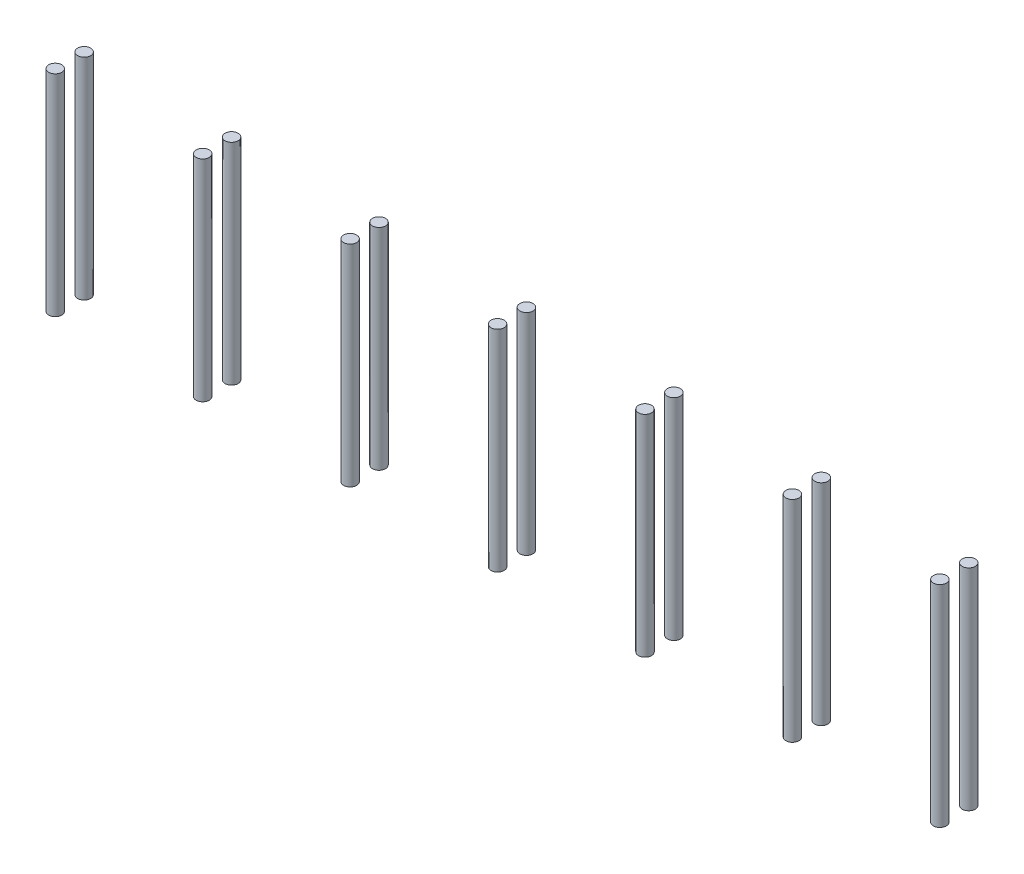
ISO-10303-21;
HEADER;
FILE_DESCRIPTION(('STEP AP214'),'2;1');
FILE_NAME('part.step','',(''),(''),'','','');
FILE_SCHEMA(('AUTOMOTIVE_DESIGN { 1 0 10303 214 1 1 1 1 }'));
ENDSEC;
DATA;
#1=APPLICATION_CONTEXT('core data for automotive mechanical design processes');
#2=APPLICATION_PROTOCOL_DEFINITION('international standard','automotive_design',2000,#1);
#3=PRODUCT_CONTEXT('',#1,'mechanical');
#4=PRODUCT('Part','Part','',(#3));
#5=PRODUCT_RELATED_PRODUCT_CATEGORY('part','',(#4));
#6=PRODUCT_DEFINITION_FORMATION('','',#4);
#7=PRODUCT_DEFINITION_CONTEXT('part definition',#1,'design');
#8=PRODUCT_DEFINITION('design','',#6,#7);
#9=PRODUCT_DEFINITION_SHAPE('','',#8);
#10=(LENGTH_UNIT() NAMED_UNIT(*) SI_UNIT(.MILLI.,.METRE.));
#11=(NAMED_UNIT(*) PLANE_ANGLE_UNIT() SI_UNIT($,.RADIAN.));
#12=(NAMED_UNIT(*) SI_UNIT($,.STERADIAN.) SOLID_ANGLE_UNIT());
#13=UNCERTAINTY_MEASURE_WITH_UNIT(LENGTH_MEASURE(1.E-05),#10,'distance_accuracy_value','');
#14=(GEOMETRIC_REPRESENTATION_CONTEXT(3) GLOBAL_UNCERTAINTY_ASSIGNED_CONTEXT((#13)) GLOBAL_UNIT_ASSIGNED_CONTEXT((#10,
#11,#12)) REPRESENTATION_CONTEXT('',''));
#15=CARTESIAN_POINT('',(0.,0.,0.));
#16=DIRECTION('',(0.,0.,1.));
#17=DIRECTION('',(1.,0.,0.));
#18=AXIS2_PLACEMENT_3D('',#15,#16,#17);
#19=CARTESIAN_POINT('',(362.5,109.980256121071,-27.9999999999911));
#20=DIRECTION('',(0.,-1.,0.));
#21=DIRECTION('',(1.,0.,0.));
#22=AXIS2_PLACEMENT_3D('',#19,#20,#21);
#23=CYLINDRICAL_SURFACE('',#22,3.17499999999997);
#24=CARTESIAN_POINT('',(362.5,-0.999999999998734,-27.9999999999911));
#25=DIRECTION('',(0.,1.,0.));
#26=DIRECTION('',(-1.,0.,0.));
#27=AXIS2_PLACEMENT_3D('',#24,#25,#26);
#28=CIRCLE('',#27,3.17499999999997);
#29=CARTESIAN_POINT('',(359.325,-0.999999999998745,-27.9999999999911));
#30=VERTEX_POINT('',#29);
#31=EDGE_CURVE('E47',#30,#30,#28,.T.);
#32=ORIENTED_EDGE('',*,*,#31,.T.);
#33=EDGE_LOOP('',(#32));
#34=FACE_BOUND('',#33,.T.);
#35=CARTESIAN_POINT('',(362.5,101.000000000001,-27.9999999999911));
#36=DIRECTION('',(0.,1.,0.));
#37=DIRECTION('',(-1.,0.,0.));
#38=AXIS2_PLACEMENT_3D('',#35,#36,#37);
#39=CIRCLE('',#38,3.17499999999997);
#40=CARTESIAN_POINT('',(359.325,101.000000000001,-27.9999999999911));
#41=VERTEX_POINT('',#40);
#42=EDGE_CURVE('E11',#41,#41,#39,.T.);
#43=ORIENTED_EDGE('',*,*,#42,.F.);
#44=EDGE_LOOP('',(#43));
#45=FACE_BOUND('',#44,.T.);
#46=ADVANCED_FACE('F40',(#34,#45),#23,.T.);
#47=CARTESIAN_POINT('',(362.5,-0.999999999998734,-27.9999999999911));
#48=DIRECTION('',(0.,1.,0.));
#49=DIRECTION('',(-1.,0.,0.));
#50=AXIS2_PLACEMENT_3D('',#47,#48,#49);
#51=PLANE('',#50);
#52=ORIENTED_EDGE('',*,*,#31,.F.);
#53=EDGE_LOOP('',(#52));
#54=FACE_BOUND('',#53,.T.);
#55=ADVANCED_FACE('F55',(#54),#51,.F.);
#56=CARTESIAN_POINT('',(-66.5000000000003,101.,-41.9999999999911));
#57=DIRECTION('',(0.,1.,0.));
#58=DIRECTION('',(-1.,0.,0.));
#59=AXIS2_PLACEMENT_3D('',#56,#57,#58);
#60=PLANE('',#59);
#61=ORIENTED_EDGE('',*,*,#42,.T.);
#62=EDGE_LOOP('',(#61));
#63=FACE_BOUND('',#62,.T.);
#64=ADVANCED_FACE('F42',(#63),#60,.T.);
#65=CLOSED_SHELL('',(#46,#55,#64));
#66=MANIFOLD_SOLID_BREP('B2',#65);
#67=CARTESIAN_POINT('',(362.5,109.980256121071,-41.9999999999911));
#68=DIRECTION('',(0.,-1.,0.));
#69=DIRECTION('',(1.,0.,0.));
#70=AXIS2_PLACEMENT_3D('',#67,#68,#69);
#71=CYLINDRICAL_SURFACE('',#70,3.17500000000002);
#72=CARTESIAN_POINT('',(362.5,-0.999999999998734,-41.9999999999911));
#73=DIRECTION('',(0.,1.,0.));
#74=DIRECTION('',(-1.,0.,0.));
#75=AXIS2_PLACEMENT_3D('',#72,#73,#74);
#76=CIRCLE('',#75,3.17500000000002);
#77=CARTESIAN_POINT('',(359.325,-0.999999999998745,-41.9999999999911));
#78=VERTEX_POINT('',#77);
#79=EDGE_CURVE('E96',#78,#78,#76,.T.);
#80=ORIENTED_EDGE('',*,*,#79,.T.);
#81=EDGE_LOOP('',(#80));
#82=FACE_BOUND('',#81,.T.);
#83=CARTESIAN_POINT('',(362.5,101.000000000001,-41.9999999999911));
#84=DIRECTION('',(0.,1.,0.));
#85=DIRECTION('',(-1.,0.,0.));
#86=AXIS2_PLACEMENT_3D('',#83,#84,#85);
#87=CIRCLE('',#86,3.17500000000002);
#88=CARTESIAN_POINT('',(359.325,101.000000000001,-41.9999999999911));
#89=VERTEX_POINT('',#88);
#90=EDGE_CURVE('E39',#89,#89,#87,.T.);
#91=ORIENTED_EDGE('',*,*,#90,.F.);
#92=EDGE_LOOP('',(#91));
#93=FACE_BOUND('',#92,.T.);
#94=ADVANCED_FACE('F89',(#82,#93),#71,.T.);
#95=CARTESIAN_POINT('',(362.5,-0.999999999998734,-41.9999999999911));
#96=DIRECTION('',(0.,1.,0.));
#97=DIRECTION('',(-1.,0.,0.));
#98=AXIS2_PLACEMENT_3D('',#95,#96,#97);
#99=PLANE('',#98);
#100=ORIENTED_EDGE('',*,*,#79,.F.);
#101=EDGE_LOOP('',(#100));
#102=FACE_BOUND('',#101,.T.);
#103=ADVANCED_FACE('F104',(#102),#99,.F.);
#104=CARTESIAN_POINT('',(-66.5000000000003,101.,-41.9999999999911));
#105=DIRECTION('',(0.,1.,0.));
#106=DIRECTION('',(-1.,0.,0.));
#107=AXIS2_PLACEMENT_3D('',#104,#105,#106);
#108=PLANE('',#107);
#109=ORIENTED_EDGE('',*,*,#90,.T.);
#110=EDGE_LOOP('',(#109));
#111=FACE_BOUND('',#110,.T.);
#112=ADVANCED_FACE('F91',(#111),#108,.T.);
#113=CLOSED_SHELL('',(#94,#103,#112));
#114=MANIFOLD_SOLID_BREP('B6',#113);
#115=CARTESIAN_POINT('',(291.,109.98025612107,-27.9999999999911));
#116=DIRECTION('',(0.,-1.,0.));
#117=DIRECTION('',(1.,0.,0.));
#118=AXIS2_PLACEMENT_3D('',#115,#116,#117);
#119=CYLINDRICAL_SURFACE('',#118,3.17499999999997);
#120=CARTESIAN_POINT('',(291.,-0.999999999998984,-27.9999999999911));
#121=DIRECTION('',(0.,1.,0.));
#122=DIRECTION('',(-1.,0.,0.));
#123=AXIS2_PLACEMENT_3D('',#120,#121,#122);
#124=CIRCLE('',#123,3.17499999999997);
#125=CARTESIAN_POINT('',(287.825,-0.999999999998995,-27.9999999999911));
#126=VERTEX_POINT('',#125);
#127=EDGE_CURVE('E145',#126,#126,#124,.T.);
#128=ORIENTED_EDGE('',*,*,#127,.T.);
#129=EDGE_LOOP('',(#128));
#130=FACE_BOUND('',#129,.T.);
#131=CARTESIAN_POINT('',(291.,101.000000000001,-27.9999999999911));
#132=DIRECTION('',(0.,1.,0.));
#133=DIRECTION('',(-1.,0.,0.));
#134=AXIS2_PLACEMENT_3D('',#131,#132,#133);
#135=CIRCLE('',#134,3.17499999999997);
#136=CARTESIAN_POINT('',(287.825,101.000000000001,-27.9999999999911));
#137=VERTEX_POINT('',#136);
#138=EDGE_CURVE('E88',#137,#137,#135,.T.);
#139=ORIENTED_EDGE('',*,*,#138,.F.);
#140=EDGE_LOOP('',(#139));
#141=FACE_BOUND('',#140,.T.);
#142=ADVANCED_FACE('F138',(#130,#141),#119,.T.);
#143=CARTESIAN_POINT('',(291.,-0.999999999998984,-27.9999999999911));
#144=DIRECTION('',(0.,1.,0.));
#145=DIRECTION('',(-1.,0.,0.));
#146=AXIS2_PLACEMENT_3D('',#143,#144,#145);
#147=PLANE('',#146);
#148=ORIENTED_EDGE('',*,*,#127,.F.);
#149=EDGE_LOOP('',(#148));
#150=FACE_BOUND('',#149,.T.);
#151=ADVANCED_FACE('F153',(#150),#147,.F.);
#152=CARTESIAN_POINT('',(-66.5000000000003,101.,-41.9999999999911));
#153=DIRECTION('',(0.,1.,0.));
#154=DIRECTION('',(-1.,0.,0.));
#155=AXIS2_PLACEMENT_3D('',#152,#153,#154);
#156=PLANE('',#155);
#157=ORIENTED_EDGE('',*,*,#138,.T.);
#158=EDGE_LOOP('',(#157));
#159=FACE_BOUND('',#158,.T.);
#160=ADVANCED_FACE('F140',(#159),#156,.T.);
#161=CLOSED_SHELL('',(#142,#151,#160));
#162=MANIFOLD_SOLID_BREP('B34',#161);
#163=CARTESIAN_POINT('',(291.,109.98025612107,-41.9999999999911));
#164=DIRECTION('',(0.,-1.,0.));
#165=DIRECTION('',(1.,0.,0.));
#166=AXIS2_PLACEMENT_3D('',#163,#164,#165);
#167=CYLINDRICAL_SURFACE('',#166,3.17500000000002);
#168=CARTESIAN_POINT('',(291.,-0.999999999998984,-41.9999999999911));
#169=DIRECTION('',(0.,1.,0.));
#170=DIRECTION('',(-1.,0.,0.));
#171=AXIS2_PLACEMENT_3D('',#168,#169,#170);
#172=CIRCLE('',#171,3.17500000000002);
#173=CARTESIAN_POINT('',(287.825,-0.999999999998995,-41.9999999999911));
#174=VERTEX_POINT('',#173);
#175=EDGE_CURVE('E194',#174,#174,#172,.T.);
#176=ORIENTED_EDGE('',*,*,#175,.T.);
#177=EDGE_LOOP('',(#176));
#178=FACE_BOUND('',#177,.T.);
#179=CARTESIAN_POINT('',(291.,101.000000000001,-41.9999999999911));
#180=DIRECTION('',(0.,1.,0.));
#181=DIRECTION('',(-1.,0.,0.));
#182=AXIS2_PLACEMENT_3D('',#179,#180,#181);
#183=CIRCLE('',#182,3.17500000000002);
#184=CARTESIAN_POINT('',(287.825,101.000000000001,-41.9999999999911));
#185=VERTEX_POINT('',#184);
#186=EDGE_CURVE('E137',#185,#185,#183,.T.);
#187=ORIENTED_EDGE('',*,*,#186,.F.);
#188=EDGE_LOOP('',(#187));
#189=FACE_BOUND('',#188,.T.);
#190=ADVANCED_FACE('F187',(#178,#189),#167,.T.);
#191=CARTESIAN_POINT('',(291.,-0.999999999998984,-41.9999999999911));
#192=DIRECTION('',(0.,1.,0.));
#193=DIRECTION('',(-1.,0.,0.));
#194=AXIS2_PLACEMENT_3D('',#191,#192,#193);
#195=PLANE('',#194);
#196=ORIENTED_EDGE('',*,*,#175,.F.);
#197=EDGE_LOOP('',(#196));
#198=FACE_BOUND('',#197,.T.);
#199=ADVANCED_FACE('F202',(#198),#195,.F.);
#200=CARTESIAN_POINT('',(-66.5000000000003,101.,-41.9999999999911));
#201=DIRECTION('',(0.,1.,0.));
#202=DIRECTION('',(-1.,0.,0.));
#203=AXIS2_PLACEMENT_3D('',#200,#201,#202);
#204=PLANE('',#203);
#205=ORIENTED_EDGE('',*,*,#186,.T.);
#206=EDGE_LOOP('',(#205));
#207=FACE_BOUND('',#206,.T.);
#208=ADVANCED_FACE('F189',(#207),#204,.T.);
#209=CLOSED_SHELL('',(#190,#199,#208));
#210=MANIFOLD_SOLID_BREP('B83',#209);
#211=CARTESIAN_POINT('',(219.5,109.98025612107,-27.9999999999911));
#212=DIRECTION('',(0.,-1.,0.));
#213=DIRECTION('',(1.,0.,0.));
#214=AXIS2_PLACEMENT_3D('',#211,#212,#213);
#215=CYLINDRICAL_SURFACE('',#214,3.17499999999997);
#216=CARTESIAN_POINT('',(219.5,-0.999999999999234,-27.9999999999911));
#217=DIRECTION('',(0.,1.,0.));
#218=DIRECTION('',(-1.,0.,0.));
#219=AXIS2_PLACEMENT_3D('',#216,#217,#218);
#220=CIRCLE('',#219,3.17499999999997);
#221=CARTESIAN_POINT('',(216.325,-0.999999999999245,-27.9999999999911));
#222=VERTEX_POINT('',#221);
#223=EDGE_CURVE('E243',#222,#222,#220,.T.);
#224=ORIENTED_EDGE('',*,*,#223,.T.);
#225=EDGE_LOOP('',(#224));
#226=FACE_BOUND('',#225,.T.);
#227=CARTESIAN_POINT('',(219.5,101.000000000001,-27.9999999999911));
#228=DIRECTION('',(0.,1.,0.));
#229=DIRECTION('',(-1.,0.,0.));
#230=AXIS2_PLACEMENT_3D('',#227,#228,#229);
#231=CIRCLE('',#230,3.17499999999997);
#232=CARTESIAN_POINT('',(216.325,101.000000000001,-27.9999999999911));
#233=VERTEX_POINT('',#232);
#234=EDGE_CURVE('E186',#233,#233,#231,.T.);
#235=ORIENTED_EDGE('',*,*,#234,.F.);
#236=EDGE_LOOP('',(#235));
#237=FACE_BOUND('',#236,.T.);
#238=ADVANCED_FACE('F236',(#226,#237),#215,.T.);
#239=CARTESIAN_POINT('',(219.5,-0.999999999999234,-27.9999999999911));
#240=DIRECTION('',(0.,1.,0.));
#241=DIRECTION('',(-1.,0.,0.));
#242=AXIS2_PLACEMENT_3D('',#239,#240,#241);
#243=PLANE('',#242);
#244=ORIENTED_EDGE('',*,*,#223,.F.);
#245=EDGE_LOOP('',(#244));
#246=FACE_BOUND('',#245,.T.);
#247=ADVANCED_FACE('F251',(#246),#243,.F.);
#248=CARTESIAN_POINT('',(-66.5000000000003,101.,-41.9999999999911));
#249=DIRECTION('',(0.,1.,0.));
#250=DIRECTION('',(-1.,0.,0.));
#251=AXIS2_PLACEMENT_3D('',#248,#249,#250);
#252=PLANE('',#251);
#253=ORIENTED_EDGE('',*,*,#234,.T.);
#254=EDGE_LOOP('',(#253));
#255=FACE_BOUND('',#254,.T.);
#256=ADVANCED_FACE('F238',(#255),#252,.T.);
#257=CLOSED_SHELL('',(#238,#247,#256));
#258=MANIFOLD_SOLID_BREP('B132',#257);
#259=CARTESIAN_POINT('',(219.5,109.98025612107,-41.9999999999911));
#260=DIRECTION('',(0.,-1.,0.));
#261=DIRECTION('',(1.,0.,0.));
#262=AXIS2_PLACEMENT_3D('',#259,#260,#261);
#263=CYLINDRICAL_SURFACE('',#262,3.17500000000002);
#264=CARTESIAN_POINT('',(219.5,-0.999999999999234,-41.9999999999911));
#265=DIRECTION('',(0.,1.,0.));
#266=DIRECTION('',(-1.,0.,0.));
#267=AXIS2_PLACEMENT_3D('',#264,#265,#266);
#268=CIRCLE('',#267,3.17500000000002);
#269=CARTESIAN_POINT('',(216.325,-0.999999999999245,-41.9999999999911));
#270=VERTEX_POINT('',#269);
#271=EDGE_CURVE('E292',#270,#270,#268,.T.);
#272=ORIENTED_EDGE('',*,*,#271,.T.);
#273=EDGE_LOOP('',(#272));
#274=FACE_BOUND('',#273,.T.);
#275=CARTESIAN_POINT('',(219.5,101.000000000001,-41.9999999999911));
#276=DIRECTION('',(0.,1.,0.));
#277=DIRECTION('',(-1.,0.,0.));
#278=AXIS2_PLACEMENT_3D('',#275,#276,#277);
#279=CIRCLE('',#278,3.17500000000002);
#280=CARTESIAN_POINT('',(216.325,101.000000000001,-41.9999999999911));
#281=VERTEX_POINT('',#280);
#282=EDGE_CURVE('E235',#281,#281,#279,.T.);
#283=ORIENTED_EDGE('',*,*,#282,.F.);
#284=EDGE_LOOP('',(#283));
#285=FACE_BOUND('',#284,.T.);
#286=ADVANCED_FACE('F285',(#274,#285),#263,.T.);
#287=CARTESIAN_POINT('',(219.5,-0.999999999999234,-41.9999999999911));
#288=DIRECTION('',(0.,1.,0.));
#289=DIRECTION('',(-1.,0.,0.));
#290=AXIS2_PLACEMENT_3D('',#287,#288,#289);
#291=PLANE('',#290);
#292=ORIENTED_EDGE('',*,*,#271,.F.);
#293=EDGE_LOOP('',(#292));
#294=FACE_BOUND('',#293,.T.);
#295=ADVANCED_FACE('F300',(#294),#291,.F.);
#296=CARTESIAN_POINT('',(-66.5000000000003,101.,-41.9999999999911));
#297=DIRECTION('',(0.,1.,0.));
#298=DIRECTION('',(-1.,0.,0.));
#299=AXIS2_PLACEMENT_3D('',#296,#297,#298);
#300=PLANE('',#299);
#301=ORIENTED_EDGE('',*,*,#282,.T.);
#302=EDGE_LOOP('',(#301));
#303=FACE_BOUND('',#302,.T.);
#304=ADVANCED_FACE('F287',(#303),#300,.T.);
#305=CLOSED_SHELL('',(#286,#295,#304));
#306=MANIFOLD_SOLID_BREP('B181',#305);
#307=CARTESIAN_POINT('',(148.,109.98025612107,-27.9999999999911));
#308=DIRECTION('',(0.,-1.,0.));
#309=DIRECTION('',(1.,0.,0.));
#310=AXIS2_PLACEMENT_3D('',#307,#308,#309);
#311=CYLINDRICAL_SURFACE('',#310,3.17499999999997);
#312=CARTESIAN_POINT('',(148.,-0.999999999999483,-27.9999999999911));
#313=DIRECTION('',(0.,1.,0.));
#314=DIRECTION('',(-1.,0.,0.));
#315=AXIS2_PLACEMENT_3D('',#312,#313,#314);
#316=CIRCLE('',#315,3.17499999999997);
#317=CARTESIAN_POINT('',(144.825,-0.999999999999494,-27.9999999999911));
#318=VERTEX_POINT('',#317);
#319=EDGE_CURVE('E341',#318,#318,#316,.T.);
#320=ORIENTED_EDGE('',*,*,#319,.T.);
#321=EDGE_LOOP('',(#320));
#322=FACE_BOUND('',#321,.T.);
#323=CARTESIAN_POINT('',(148.,101.000000000001,-27.9999999999911));
#324=DIRECTION('',(0.,1.,0.));
#325=DIRECTION('',(-1.,0.,0.));
#326=AXIS2_PLACEMENT_3D('',#323,#324,#325);
#327=CIRCLE('',#326,3.17499999999997);
#328=CARTESIAN_POINT('',(144.825,101.000000000001,-27.9999999999911));
#329=VERTEX_POINT('',#328);
#330=EDGE_CURVE('E284',#329,#329,#327,.T.);
#331=ORIENTED_EDGE('',*,*,#330,.F.);
#332=EDGE_LOOP('',(#331));
#333=FACE_BOUND('',#332,.T.);
#334=ADVANCED_FACE('F334',(#322,#333),#311,.T.);
#335=CARTESIAN_POINT('',(148.,-0.999999999999483,-27.9999999999911));
#336=DIRECTION('',(0.,1.,0.));
#337=DIRECTION('',(-1.,0.,0.));
#338=AXIS2_PLACEMENT_3D('',#335,#336,#337);
#339=PLANE('',#338);
#340=ORIENTED_EDGE('',*,*,#319,.F.);
#341=EDGE_LOOP('',(#340));
#342=FACE_BOUND('',#341,.T.);
#343=ADVANCED_FACE('F349',(#342),#339,.F.);
#344=CARTESIAN_POINT('',(-66.5000000000003,101.,-41.9999999999911));
#345=DIRECTION('',(0.,1.,0.));
#346=DIRECTION('',(-1.,0.,0.));
#347=AXIS2_PLACEMENT_3D('',#344,#345,#346);
#348=PLANE('',#347);
#349=ORIENTED_EDGE('',*,*,#330,.T.);
#350=EDGE_LOOP('',(#349));
#351=FACE_BOUND('',#350,.T.);
#352=ADVANCED_FACE('F336',(#351),#348,.T.);
#353=CLOSED_SHELL('',(#334,#343,#352));
#354=MANIFOLD_SOLID_BREP('B230',#353);
#355=CARTESIAN_POINT('',(148.,109.98025612107,-41.9999999999911));
#356=DIRECTION('',(0.,-1.,0.));
#357=DIRECTION('',(1.,0.,0.));
#358=AXIS2_PLACEMENT_3D('',#355,#356,#357);
#359=CYLINDRICAL_SURFACE('',#358,3.17500000000002);
#360=CARTESIAN_POINT('',(148.,-0.999999999999483,-41.9999999999911));
#361=DIRECTION('',(0.,1.,0.));
#362=DIRECTION('',(-1.,0.,0.));
#363=AXIS2_PLACEMENT_3D('',#360,#361,#362);
#364=CIRCLE('',#363,3.17500000000002);
#365=CARTESIAN_POINT('',(144.825,-0.999999999999494,-41.9999999999911));
#366=VERTEX_POINT('',#365);
#367=EDGE_CURVE('E390',#366,#366,#364,.T.);
#368=ORIENTED_EDGE('',*,*,#367,.T.);
#369=EDGE_LOOP('',(#368));
#370=FACE_BOUND('',#369,.T.);
#371=CARTESIAN_POINT('',(148.,101.000000000001,-41.9999999999911));
#372=DIRECTION('',(0.,1.,0.));
#373=DIRECTION('',(-1.,0.,0.));
#374=AXIS2_PLACEMENT_3D('',#371,#372,#373);
#375=CIRCLE('',#374,3.17500000000002);
#376=CARTESIAN_POINT('',(144.825,101.000000000001,-41.9999999999911));
#377=VERTEX_POINT('',#376);
#378=EDGE_CURVE('E333',#377,#377,#375,.T.);
#379=ORIENTED_EDGE('',*,*,#378,.F.);
#380=EDGE_LOOP('',(#379));
#381=FACE_BOUND('',#380,.T.);
#382=ADVANCED_FACE('F383',(#370,#381),#359,.T.);
#383=CARTESIAN_POINT('',(148.,-0.999999999999483,-41.9999999999911));
#384=DIRECTION('',(0.,1.,0.));
#385=DIRECTION('',(-1.,0.,0.));
#386=AXIS2_PLACEMENT_3D('',#383,#384,#385);
#387=PLANE('',#386);
#388=ORIENTED_EDGE('',*,*,#367,.F.);
#389=EDGE_LOOP('',(#388));
#390=FACE_BOUND('',#389,.T.);
#391=ADVANCED_FACE('F398',(#390),#387,.F.);
#392=CARTESIAN_POINT('',(-66.5000000000003,101.,-41.9999999999911));
#393=DIRECTION('',(0.,1.,0.));
#394=DIRECTION('',(-1.,0.,0.));
#395=AXIS2_PLACEMENT_3D('',#392,#393,#394);
#396=PLANE('',#395);
#397=ORIENTED_EDGE('',*,*,#378,.T.);
#398=EDGE_LOOP('',(#397));
#399=FACE_BOUND('',#398,.T.);
#400=ADVANCED_FACE('F385',(#399),#396,.T.);
#401=CLOSED_SHELL('',(#382,#391,#400));
#402=MANIFOLD_SOLID_BREP('B279',#401);
#403=CARTESIAN_POINT('',(76.4999999999996,109.98025612107,-27.9999999999911));
#404=DIRECTION('',(0.,-1.,0.));
#405=DIRECTION('',(1.,0.,0.));
#406=AXIS2_PLACEMENT_3D('',#403,#404,#405);
#407=CYLINDRICAL_SURFACE('',#406,3.175);
#408=CARTESIAN_POINT('',(76.5,-0.999999999999733,-27.9999999999911));
#409=DIRECTION('',(0.,1.,0.));
#410=DIRECTION('',(-1.,0.,0.));
#411=AXIS2_PLACEMENT_3D('',#408,#409,#410);
#412=CIRCLE('',#411,3.175);
#413=CARTESIAN_POINT('',(73.325,-0.999999999999744,-27.9999999999911));
#414=VERTEX_POINT('',#413);
#415=EDGE_CURVE('E439',#414,#414,#412,.T.);
#416=ORIENTED_EDGE('',*,*,#415,.T.);
#417=EDGE_LOOP('',(#416));
#418=FACE_BOUND('',#417,.T.);
#419=CARTESIAN_POINT('',(76.4999999999997,101.,-27.9999999999911));
#420=DIRECTION('',(0.,1.,0.));
#421=DIRECTION('',(-1.,0.,0.));
#422=AXIS2_PLACEMENT_3D('',#419,#420,#421);
#423=CIRCLE('',#422,3.175);
#424=CARTESIAN_POINT('',(73.3249999999997,101.,-27.9999999999911));
#425=VERTEX_POINT('',#424);
#426=EDGE_CURVE('E382',#425,#425,#423,.T.);
#427=ORIENTED_EDGE('',*,*,#426,.F.);
#428=EDGE_LOOP('',(#427));
#429=FACE_BOUND('',#428,.T.);
#430=ADVANCED_FACE('F432',(#418,#429),#407,.T.);
#431=CARTESIAN_POINT('',(76.5,-0.999999999999733,-27.9999999999911));
#432=DIRECTION('',(0.,1.,0.));
#433=DIRECTION('',(-1.,0.,0.));
#434=AXIS2_PLACEMENT_3D('',#431,#432,#433);
#435=PLANE('',#434);
#436=ORIENTED_EDGE('',*,*,#415,.F.);
#437=EDGE_LOOP('',(#436));
#438=FACE_BOUND('',#437,.T.);
#439=ADVANCED_FACE('F447',(#438),#435,.F.);
#440=CARTESIAN_POINT('',(-66.5000000000003,101.,-41.9999999999911));
#441=DIRECTION('',(0.,1.,0.));
#442=DIRECTION('',(-1.,0.,0.));
#443=AXIS2_PLACEMENT_3D('',#440,#441,#442);
#444=PLANE('',#443);
#445=ORIENTED_EDGE('',*,*,#426,.T.);
#446=EDGE_LOOP('',(#445));
#447=FACE_BOUND('',#446,.T.);
#448=ADVANCED_FACE('F434',(#447),#444,.T.);
#449=CLOSED_SHELL('',(#430,#439,#448));
#450=MANIFOLD_SOLID_BREP('B328',#449);
#451=CARTESIAN_POINT('',(76.4999999999997,109.98025612107,-41.9999999999911));
#452=DIRECTION('',(0.,-1.,0.));
#453=DIRECTION('',(1.,0.,0.));
#454=AXIS2_PLACEMENT_3D('',#451,#452,#453);
#455=CYLINDRICAL_SURFACE('',#454,3.175);
#456=CARTESIAN_POINT('',(76.5000000000001,-0.999999999999733,-41.9999999999911));
#457=DIRECTION('',(0.,1.,0.));
#458=DIRECTION('',(-1.,0.,0.));
#459=AXIS2_PLACEMENT_3D('',#456,#457,#458);
#460=CIRCLE('',#459,3.175);
#461=CARTESIAN_POINT('',(73.3250000000001,-0.999999999999744,-41.9999999999911));
#462=VERTEX_POINT('',#461);
#463=EDGE_CURVE('E488',#462,#462,#460,.T.);
#464=ORIENTED_EDGE('',*,*,#463,.T.);
#465=EDGE_LOOP('',(#464));
#466=FACE_BOUND('',#465,.T.);
#467=CARTESIAN_POINT('',(76.4999999999997,101.,-41.9999999999911));
#468=DIRECTION('',(0.,1.,0.));
#469=DIRECTION('',(-1.,0.,0.));
#470=AXIS2_PLACEMENT_3D('',#467,#468,#469);
#471=CIRCLE('',#470,3.175);
#472=CARTESIAN_POINT('',(73.3249999999997,101.,-41.9999999999911));
#473=VERTEX_POINT('',#472);
#474=EDGE_CURVE('E431',#473,#473,#471,.T.);
#475=ORIENTED_EDGE('',*,*,#474,.F.);
#476=EDGE_LOOP('',(#475));
#477=FACE_BOUND('',#476,.T.);
#478=ADVANCED_FACE('F481',(#466,#477),#455,.T.);
#479=CARTESIAN_POINT('',(76.5000000000001,-0.999999999999733,-41.9999999999911));
#480=DIRECTION('',(0.,1.,0.));
#481=DIRECTION('',(-1.,0.,0.));
#482=AXIS2_PLACEMENT_3D('',#479,#480,#481);
#483=PLANE('',#482);
#484=ORIENTED_EDGE('',*,*,#463,.F.);
#485=EDGE_LOOP('',(#484));
#486=FACE_BOUND('',#485,.T.);
#487=ADVANCED_FACE('F496',(#486),#483,.F.);
#488=CARTESIAN_POINT('',(-66.5000000000003,101.,-41.9999999999911));
#489=DIRECTION('',(0.,1.,0.));
#490=DIRECTION('',(-1.,0.,0.));
#491=AXIS2_PLACEMENT_3D('',#488,#489,#490);
#492=PLANE('',#491);
#493=ORIENTED_EDGE('',*,*,#474,.T.);
#494=EDGE_LOOP('',(#493));
#495=FACE_BOUND('',#494,.T.);
#496=ADVANCED_FACE('F483',(#495),#492,.T.);
#497=CLOSED_SHELL('',(#478,#487,#496));
#498=MANIFOLD_SOLID_BREP('B377',#497);
#499=CARTESIAN_POINT('',(4.99999999999965,109.980256121069,-27.9999999999911));
#500=DIRECTION('',(0.,-1.,0.));
#501=DIRECTION('',(1.,0.,0.));
#502=AXIS2_PLACEMENT_3D('',#499,#500,#501);
#503=CYLINDRICAL_SURFACE('',#502,3.175);
#504=CARTESIAN_POINT('',(5.00000000000004,-0.999999999999982,-27.9999999999911));
#505=DIRECTION('',(0.,1.,0.));
#506=DIRECTION('',(-1.,0.,0.));
#507=AXIS2_PLACEMENT_3D('',#504,#505,#506);
#508=CIRCLE('',#507,3.175);
#509=CARTESIAN_POINT('',(1.82500000000004,-0.999999999999993,-27.9999999999911));
#510=VERTEX_POINT('',#509);
#511=EDGE_CURVE('E537',#510,#510,#508,.T.);
#512=ORIENTED_EDGE('',*,*,#511,.T.);
#513=EDGE_LOOP('',(#512));
#514=FACE_BOUND('',#513,.T.);
#515=CARTESIAN_POINT('',(4.99999999999968,101.,-27.9999999999911));
#516=DIRECTION('',(0.,1.,0.));
#517=DIRECTION('',(-1.,0.,0.));
#518=AXIS2_PLACEMENT_3D('',#515,#516,#517);
#519=CIRCLE('',#518,3.175);
#520=CARTESIAN_POINT('',(1.82499999999968,101.,-27.9999999999911));
#521=VERTEX_POINT('',#520);
#522=EDGE_CURVE('E480',#521,#521,#519,.T.);
#523=ORIENTED_EDGE('',*,*,#522,.F.);
#524=EDGE_LOOP('',(#523));
#525=FACE_BOUND('',#524,.T.);
#526=ADVANCED_FACE('F530',(#514,#525),#503,.T.);
#527=CARTESIAN_POINT('',(5.00000000000004,-0.999999999999982,-27.9999999999911));
#528=DIRECTION('',(0.,1.,0.));
#529=DIRECTION('',(-1.,0.,0.));
#530=AXIS2_PLACEMENT_3D('',#527,#528,#529);
#531=PLANE('',#530);
#532=ORIENTED_EDGE('',*,*,#511,.F.);
#533=EDGE_LOOP('',(#532));
#534=FACE_BOUND('',#533,.T.);
#535=ADVANCED_FACE('F545',(#534),#531,.F.);
#536=CARTESIAN_POINT('',(-66.5000000000003,101.,-41.9999999999911));
#537=DIRECTION('',(0.,1.,0.));
#538=DIRECTION('',(-1.,0.,0.));
#539=AXIS2_PLACEMENT_3D('',#536,#537,#538);
#540=PLANE('',#539);
#541=ORIENTED_EDGE('',*,*,#522,.T.);
#542=EDGE_LOOP('',(#541));
#543=FACE_BOUND('',#542,.T.);
#544=ADVANCED_FACE('F532',(#543),#540,.T.);
#545=CLOSED_SHELL('',(#526,#535,#544));
#546=MANIFOLD_SOLID_BREP('B426',#545);
#547=CARTESIAN_POINT('',(4.99999999999968,109.980256121069,-41.9999999999911));
#548=DIRECTION('',(0.,-1.,0.));
#549=DIRECTION('',(1.,0.,0.));
#550=AXIS2_PLACEMENT_3D('',#547,#548,#549);
#551=CYLINDRICAL_SURFACE('',#550,3.175);
#552=CARTESIAN_POINT('',(5.00000000000006,-0.999999999999982,-41.9999999999911));
#553=DIRECTION('',(0.,1.,0.));
#554=DIRECTION('',(-1.,0.,0.));
#555=AXIS2_PLACEMENT_3D('',#552,#553,#554);
#556=CIRCLE('',#555,3.175);
#557=CARTESIAN_POINT('',(1.82500000000007,-0.999999999999993,-41.9999999999911));
#558=VERTEX_POINT('',#557);
#559=EDGE_CURVE('E586',#558,#558,#556,.T.);
#560=ORIENTED_EDGE('',*,*,#559,.T.);
#561=EDGE_LOOP('',(#560));
#562=FACE_BOUND('',#561,.T.);
#563=CARTESIAN_POINT('',(4.99999999999971,101.,-41.9999999999911));
#564=DIRECTION('',(0.,1.,0.));
#565=DIRECTION('',(-1.,0.,0.));
#566=AXIS2_PLACEMENT_3D('',#563,#564,#565);
#567=CIRCLE('',#566,3.175);
#568=CARTESIAN_POINT('',(1.82499999999971,101.,-41.9999999999911));
#569=VERTEX_POINT('',#568);
#570=EDGE_CURVE('E529',#569,#569,#567,.T.);
#571=ORIENTED_EDGE('',*,*,#570,.F.);
#572=EDGE_LOOP('',(#571));
#573=FACE_BOUND('',#572,.T.);
#574=ADVANCED_FACE('F579',(#562,#573),#551,.T.);
#575=CARTESIAN_POINT('',(5.00000000000006,-0.999999999999982,-41.9999999999911));
#576=DIRECTION('',(0.,1.,0.));
#577=DIRECTION('',(-1.,0.,0.));
#578=AXIS2_PLACEMENT_3D('',#575,#576,#577);
#579=PLANE('',#578);
#580=ORIENTED_EDGE('',*,*,#559,.F.);
#581=EDGE_LOOP('',(#580));
#582=FACE_BOUND('',#581,.T.);
#583=ADVANCED_FACE('F594',(#582),#579,.F.);
#584=CARTESIAN_POINT('',(-66.5000000000003,101.,-41.9999999999911));
#585=DIRECTION('',(0.,1.,0.));
#586=DIRECTION('',(-1.,0.,0.));
#587=AXIS2_PLACEMENT_3D('',#584,#585,#586);
#588=PLANE('',#587);
#589=ORIENTED_EDGE('',*,*,#570,.T.);
#590=EDGE_LOOP('',(#589));
#591=FACE_BOUND('',#590,.T.);
#592=ADVANCED_FACE('F581',(#591),#588,.T.);
#593=CLOSED_SHELL('',(#574,#583,#592));
#594=MANIFOLD_SOLID_BREP('B475',#593);
#595=CARTESIAN_POINT('',(-66.5000000000004,109.980256121069,-27.9999999999911));
#596=DIRECTION('',(0.,-1.,0.));
#597=DIRECTION('',(1.,0.,0.));
#598=AXIS2_PLACEMENT_3D('',#595,#596,#597);
#599=CYLINDRICAL_SURFACE('',#598,3.175);
#600=CARTESIAN_POINT('',(-66.5,-1.00000000000023,-27.9999999999911));
#601=DIRECTION('',(0.,1.,0.));
#602=DIRECTION('',(-1.,0.,0.));
#603=AXIS2_PLACEMENT_3D('',#600,#601,#602);
#604=CIRCLE('',#603,3.175);
#605=CARTESIAN_POINT('',(-69.675,-1.00000000000024,-27.9999999999911));
#606=VERTEX_POINT('',#605);
#607=EDGE_CURVE('E634',#606,#606,#604,.T.);
#608=ORIENTED_EDGE('',*,*,#607,.T.);
#609=EDGE_LOOP('',(#608));
#610=FACE_BOUND('',#609,.T.);
#611=CARTESIAN_POINT('',(-66.5000000000003,101.,-27.9999999999911));
#612=DIRECTION('',(0.,1.,0.));
#613=DIRECTION('',(-1.,0.,0.));
#614=AXIS2_PLACEMENT_3D('',#611,#612,#613);
#615=CIRCLE('',#614,3.175);
#616=CARTESIAN_POINT('',(-69.6750000000003,101.,-27.9999999999911));
#617=VERTEX_POINT('',#616);
#618=EDGE_CURVE('E578',#617,#617,#615,.T.);
#619=ORIENTED_EDGE('',*,*,#618,.F.);
#620=EDGE_LOOP('',(#619));
#621=FACE_BOUND('',#620,.T.);
#622=ADVANCED_FACE('F627',(#610,#621),#599,.T.);
#623=CARTESIAN_POINT('',(-66.5,-1.00000000000023,-27.9999999999911));
#624=DIRECTION('',(0.,1.,0.));
#625=DIRECTION('',(-1.,0.,0.));
#626=AXIS2_PLACEMENT_3D('',#623,#624,#625);
#627=PLANE('',#626);
#628=ORIENTED_EDGE('',*,*,#607,.F.);
#629=EDGE_LOOP('',(#628));
#630=FACE_BOUND('',#629,.T.);
#631=ADVANCED_FACE('F642',(#630),#627,.F.);
#632=CARTESIAN_POINT('',(-66.5000000000003,101.,-41.9999999999911));
#633=DIRECTION('',(0.,1.,0.));
#634=DIRECTION('',(-1.,0.,0.));
#635=AXIS2_PLACEMENT_3D('',#632,#633,#634);
#636=PLANE('',#635);
#637=ORIENTED_EDGE('',*,*,#618,.T.);
#638=EDGE_LOOP('',(#637));
#639=FACE_BOUND('',#638,.T.);
#640=ADVANCED_FACE('F629',(#639),#636,.T.);
#641=CLOSED_SHELL('',(#622,#631,#640));
#642=MANIFOLD_SOLID_BREP('B524',#641);
#643=CARTESIAN_POINT('',(-66.5000000000003,109.980256121069,-41.9999999999911));
#644=DIRECTION('',(0.,-1.,0.));
#645=DIRECTION('',(1.,0.,0.));
#646=AXIS2_PLACEMENT_3D('',#643,#644,#645);
#647=CYLINDRICAL_SURFACE('',#646,3.175);
#648=CARTESIAN_POINT('',(-66.4999999999999,-1.00000000000023,-41.9999999999911));
#649=DIRECTION('',(0.,1.,0.));
#650=DIRECTION('',(-1.,0.,0.));
#651=AXIS2_PLACEMENT_3D('',#648,#649,#650);
#652=CIRCLE('',#651,3.175);
#653=CARTESIAN_POINT('',(-69.6749999999999,-1.00000000000024,-41.9999999999911));
#654=VERTEX_POINT('',#653);
#655=EDGE_CURVE('E675',#654,#654,#652,.T.);
#656=ORIENTED_EDGE('',*,*,#655,.T.);
#657=EDGE_LOOP('',(#656));
#658=FACE_BOUND('',#657,.T.);
#659=CARTESIAN_POINT('',(-66.5000000000003,101.,-41.9999999999911));
#660=DIRECTION('',(0.,1.,0.));
#661=DIRECTION('',(-1.,0.,0.));
#662=AXIS2_PLACEMENT_3D('',#659,#660,#661);
#663=CIRCLE('',#662,3.175);
#664=CARTESIAN_POINT('',(-69.6750000000003,101.,-41.9999999999911));
#665=VERTEX_POINT('',#664);
#666=EDGE_CURVE('E626',#665,#665,#663,.T.);
#667=ORIENTED_EDGE('',*,*,#666,.F.);
#668=EDGE_LOOP('',(#667));
#669=FACE_BOUND('',#668,.T.);
#670=ADVANCED_FACE('F668',(#658,#669),#647,.T.);
#671=CARTESIAN_POINT('',(-66.4999999999999,-1.00000000000023,-41.9999999999911));
#672=DIRECTION('',(0.,1.,0.));
#673=DIRECTION('',(-1.,0.,0.));
#674=AXIS2_PLACEMENT_3D('',#671,#672,#673);
#675=PLANE('',#674);
#676=ORIENTED_EDGE('',*,*,#655,.F.);
#677=EDGE_LOOP('',(#676));
#678=FACE_BOUND('',#677,.T.);
#679=ADVANCED_FACE('F683',(#678),#675,.F.);
#680=CARTESIAN_POINT('',(-66.5000000000003,101.,-41.9999999999911));
#681=DIRECTION('',(0.,1.,0.));
#682=DIRECTION('',(-1.,0.,0.));
#683=AXIS2_PLACEMENT_3D('',#680,#681,#682);
#684=PLANE('',#683);
#685=ORIENTED_EDGE('',*,*,#666,.T.);
#686=EDGE_LOOP('',(#685));
#687=FACE_BOUND('',#686,.T.);
#688=ADVANCED_FACE('F670',(#687),#684,.T.);
#689=CLOSED_SHELL('',(#670,#679,#688));
#690=MANIFOLD_SOLID_BREP('B573',#689);
#691=ADVANCED_BREP_SHAPE_REPRESENTATION('',(#18,#66,#114,#162,#210,#258,#306,#354,#402,#450,
#498,#546,#594,#642,#690),#14);
#692=SHAPE_DEFINITION_REPRESENTATION(#9,#691);
ENDSEC;
END-ISO-10303-21;
